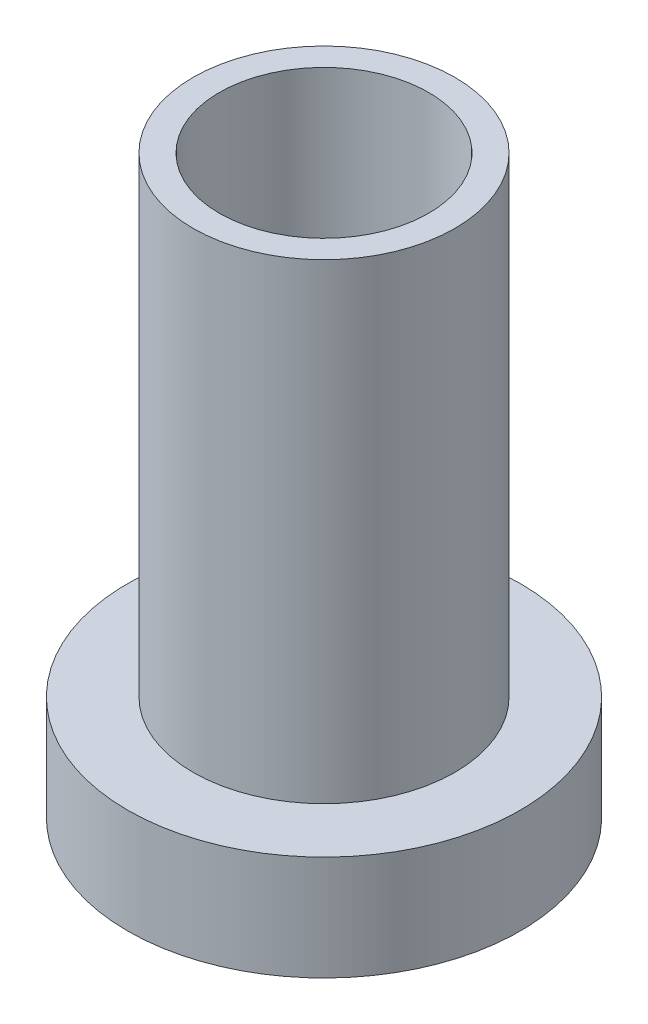
ISO-10303-21;
HEADER;
FILE_DESCRIPTION(('STEP AP214'),'2;1');
FILE_NAME('part.step','',(''),(''),'','','');
FILE_SCHEMA(('AUTOMOTIVE_DESIGN { 1 0 10303 214 1 1 1 1 }'));
ENDSEC;
DATA;
#1=APPLICATION_CONTEXT('core data for automotive mechanical design processes');
#2=APPLICATION_PROTOCOL_DEFINITION('international standard','automotive_design',2000,#1);
#3=PRODUCT_CONTEXT('',#1,'mechanical');
#4=PRODUCT('Part','Part','',(#3));
#5=PRODUCT_RELATED_PRODUCT_CATEGORY('part','',(#4));
#6=PRODUCT_DEFINITION_FORMATION('','',#4);
#7=PRODUCT_DEFINITION_CONTEXT('part definition',#1,'design');
#8=PRODUCT_DEFINITION('design','',#6,#7);
#9=PRODUCT_DEFINITION_SHAPE('','',#8);
#10=(LENGTH_UNIT() NAMED_UNIT(*) SI_UNIT(.MILLI.,.METRE.));
#11=(NAMED_UNIT(*) PLANE_ANGLE_UNIT() SI_UNIT($,.RADIAN.));
#12=(NAMED_UNIT(*) SI_UNIT($,.STERADIAN.) SOLID_ANGLE_UNIT());
#13=UNCERTAINTY_MEASURE_WITH_UNIT(LENGTH_MEASURE(1.E-05),#10,'distance_accuracy_value','');
#14=(GEOMETRIC_REPRESENTATION_CONTEXT(3) GLOBAL_UNCERTAINTY_ASSIGNED_CONTEXT((#13)) GLOBAL_UNIT_ASSIGNED_CONTEXT((#10,
#11,#12)) REPRESENTATION_CONTEXT('',''));
#15=CARTESIAN_POINT('',(0.,0.,0.));
#16=DIRECTION('',(0.,0.,1.));
#17=DIRECTION('',(1.,0.,0.));
#18=AXIS2_PLACEMENT_3D('',#15,#16,#17);
#19=CARTESIAN_POINT('',(0.,4.,0.));
#20=DIRECTION('',(0.,-1.,0.));
#21=DIRECTION('',(0.,0.,-1.));
#22=AXIS2_PLACEMENT_3D('',#19,#20,#21);
#23=CYLINDRICAL_SURFACE('',#22,7.5);
#24=CARTESIAN_POINT('',(0.,4.,0.));
#25=DIRECTION('',(0.,1.,0.));
#26=DIRECTION('',(0.,0.,1.));
#27=AXIS2_PLACEMENT_3D('',#24,#25,#26);
#28=CIRCLE('',#27,7.5);
#29=CARTESIAN_POINT('',(0.,4.,7.5));
#30=VERTEX_POINT('',#29);
#31=EDGE_CURVE('E10',#30,#30,#28,.T.);
#32=ORIENTED_EDGE('',*,*,#31,.F.);
#33=EDGE_LOOP('',(#32));
#34=FACE_BOUND('',#33,.T.);
#35=CARTESIAN_POINT('',(0.,0.,0.));
#36=DIRECTION('',(0.,1.,0.));
#37=DIRECTION('',(0.,0.,1.));
#38=AXIS2_PLACEMENT_3D('',#35,#36,#37);
#39=CIRCLE('',#38,7.5);
#40=CARTESIAN_POINT('',(0.,0.,7.5));
#41=VERTEX_POINT('',#40);
#42=EDGE_CURVE('E36',#41,#41,#39,.T.);
#43=ORIENTED_EDGE('',*,*,#42,.T.);
#44=EDGE_LOOP('',(#43));
#45=FACE_BOUND('',#44,.T.);
#46=ADVANCED_FACE('F33',(#34,#45),#23,.T.);
#47=CARTESIAN_POINT('',(0.,4.,0.));
#48=DIRECTION('',(0.,1.,0.));
#49=DIRECTION('',(0.,0.,1.));
#50=AXIS2_PLACEMENT_3D('',#47,#48,#49);
#51=PLANE('',#50);
#52=CARTESIAN_POINT('',(0.,4.,0.));
#53=DIRECTION('',(0.,1.,0.));
#54=DIRECTION('',(0.,0.,1.));
#55=AXIS2_PLACEMENT_3D('',#52,#53,#54);
#56=CIRCLE('',#55,5.);
#57=CARTESIAN_POINT('',(0.,4.,5.));
#58=VERTEX_POINT('',#57);
#59=EDGE_CURVE('E45',#58,#58,#56,.T.);
#60=ORIENTED_EDGE('',*,*,#59,.F.);
#61=EDGE_LOOP('',(#60));
#62=FACE_BOUND('',#61,.T.);
#63=ORIENTED_EDGE('',*,*,#31,.T.);
#64=EDGE_LOOP('',(#63));
#65=FACE_BOUND('',#64,.T.);
#66=ADVANCED_FACE('F78',(#62,#65),#51,.T.);
#67=CARTESIAN_POINT('',(0.,0.,0.));
#68=DIRECTION('',(0.,1.,0.));
#69=DIRECTION('',(0.,0.,1.));
#70=AXIS2_PLACEMENT_3D('',#67,#68,#69);
#71=PLANE('',#70);
#72=ORIENTED_EDGE('',*,*,#42,.F.);
#73=EDGE_LOOP('',(#72));
#74=FACE_BOUND('',#73,.T.);
#75=ADVANCED_FACE('F74',(#74),#71,.F.);
#76=CARTESIAN_POINT('',(0.,22.,0.));
#77=DIRECTION('',(0.,-1.,0.));
#78=DIRECTION('',(0.,0.,-1.));
#79=AXIS2_PLACEMENT_3D('',#76,#77,#78);
#80=CYLINDRICAL_SURFACE('',#79,5.);
#81=CARTESIAN_POINT('',(0.,22.,0.));
#82=DIRECTION('',(0.,1.,0.));
#83=DIRECTION('',(0.,0.,1.));
#84=AXIS2_PLACEMENT_3D('',#81,#82,#83);
#85=CIRCLE('',#84,5.);
#86=CARTESIAN_POINT('',(0.,22.,5.));
#87=VERTEX_POINT('',#86);
#88=EDGE_CURVE('E43',#87,#87,#85,.T.);
#89=ORIENTED_EDGE('',*,*,#88,.F.);
#90=EDGE_LOOP('',(#89));
#91=FACE_BOUND('',#90,.T.);
#92=ORIENTED_EDGE('',*,*,#59,.T.);
#93=EDGE_LOOP('',(#92));
#94=FACE_BOUND('',#93,.T.);
#95=ADVANCED_FACE('F68',(#91,#94),#80,.T.);
#96=CARTESIAN_POINT('',(0.,22.,0.));
#97=DIRECTION('',(0.,1.,0.));
#98=DIRECTION('',(0.,0.,1.));
#99=AXIS2_PLACEMENT_3D('',#96,#97,#98);
#100=PLANE('',#99);
#101=CARTESIAN_POINT('',(0.,22.,0.));
#102=DIRECTION('',(0.,1.,0.));
#103=DIRECTION('',(0.,0.,1.));
#104=AXIS2_PLACEMENT_3D('',#101,#102,#103);
#105=CIRCLE('',#104,4.);
#106=CARTESIAN_POINT('',(0.,22.,4.));
#107=VERTEX_POINT('',#106);
#108=EDGE_CURVE('E51',#107,#107,#105,.T.);
#109=ORIENTED_EDGE('',*,*,#108,.F.);
#110=EDGE_LOOP('',(#109));
#111=FACE_BOUND('',#110,.T.);
#112=ORIENTED_EDGE('',*,*,#88,.T.);
#113=EDGE_LOOP('',(#112));
#114=FACE_BOUND('',#113,.T.);
#115=ADVANCED_FACE('F62',(#111,#114),#100,.T.);
#116=CARTESIAN_POINT('',(0.,4.,0.));
#117=DIRECTION('',(0.,1.,0.));
#118=DIRECTION('',(0.,0.,1.));
#119=AXIS2_PLACEMENT_3D('',#116,#117,#118);
#120=CYLINDRICAL_SURFACE('',#119,4.);
#121=CARTESIAN_POINT('',(0.,4.,0.));
#122=DIRECTION('',(0.,1.,0.));
#123=DIRECTION('',(0.,0.,1.));
#124=AXIS2_PLACEMENT_3D('',#121,#122,#123);
#125=CIRCLE('',#124,4.);
#126=CARTESIAN_POINT('',(0.,4.,4.));
#127=VERTEX_POINT('',#126);
#128=EDGE_CURVE('E48',#127,#127,#125,.T.);
#129=ORIENTED_EDGE('',*,*,#128,.F.);
#130=EDGE_LOOP('',(#129));
#131=FACE_BOUND('',#130,.T.);
#132=ORIENTED_EDGE('',*,*,#108,.T.);
#133=EDGE_LOOP('',(#132));
#134=FACE_BOUND('',#133,.T.);
#135=ADVANCED_FACE('F59',(#131,#134),#120,.F.);
#136=CARTESIAN_POINT('',(0.,4.,0.));
#137=DIRECTION('',(0.,1.,0.));
#138=DIRECTION('',(0.,0.,1.));
#139=AXIS2_PLACEMENT_3D('',#136,#137,#138);
#140=PLANE('',#139);
#141=ORIENTED_EDGE('',*,*,#128,.T.);
#142=EDGE_LOOP('',(#141));
#143=FACE_BOUND('',#142,.T.);
#144=ADVANCED_FACE('F57',(#143),#140,.T.);
#145=CLOSED_SHELL('',(#46,#66,#75,#95,#115,#135,#144));
#146=MANIFOLD_SOLID_BREP('B2',#145);
#147=ADVANCED_BREP_SHAPE_REPRESENTATION('',(#18,#146),#14);
#148=SHAPE_DEFINITION_REPRESENTATION(#9,#147);
ENDSEC;
END-ISO-10303-21;
